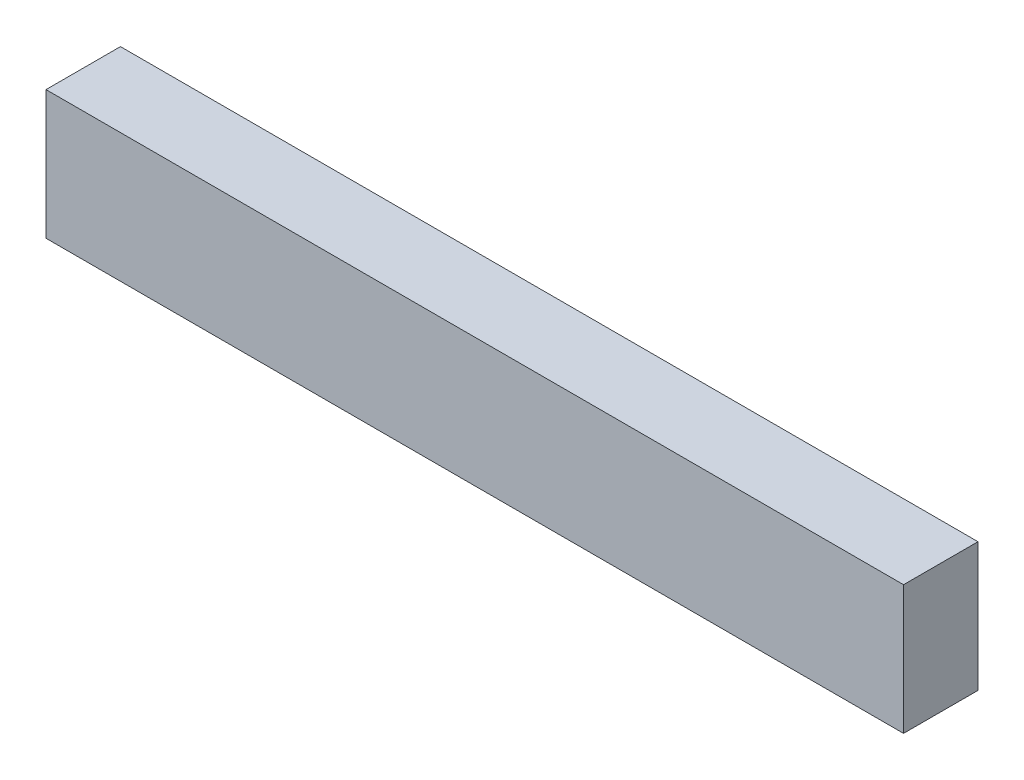
ISO-10303-21;
HEADER;
FILE_DESCRIPTION(('STEP AP214'),'2;1');
FILE_NAME('part.step','',(''),(''),'','','');
FILE_SCHEMA(('AUTOMOTIVE_DESIGN { 1 0 10303 214 1 1 1 1 }'));
ENDSEC;
DATA;
#1=APPLICATION_CONTEXT('core data for automotive mechanical design processes');
#2=APPLICATION_PROTOCOL_DEFINITION('international standard','automotive_design',2000,#1);
#3=PRODUCT_CONTEXT('',#1,'mechanical');
#4=PRODUCT('Part','Part','',(#3));
#5=PRODUCT_RELATED_PRODUCT_CATEGORY('part','',(#4));
#6=PRODUCT_DEFINITION_FORMATION('','',#4);
#7=PRODUCT_DEFINITION_CONTEXT('part definition',#1,'design');
#8=PRODUCT_DEFINITION('design','',#6,#7);
#9=PRODUCT_DEFINITION_SHAPE('','',#8);
#10=(LENGTH_UNIT() NAMED_UNIT(*) SI_UNIT(.MILLI.,.METRE.));
#11=(NAMED_UNIT(*) PLANE_ANGLE_UNIT() SI_UNIT($,.RADIAN.));
#12=(NAMED_UNIT(*) SI_UNIT($,.STERADIAN.) SOLID_ANGLE_UNIT());
#13=UNCERTAINTY_MEASURE_WITH_UNIT(LENGTH_MEASURE(1.E-05),#10,'distance_accuracy_value','');
#14=(GEOMETRIC_REPRESENTATION_CONTEXT(3) GLOBAL_UNCERTAINTY_ASSIGNED_CONTEXT((#13)) GLOBAL_UNIT_ASSIGNED_CONTEXT((#10,
#11,#12)) REPRESENTATION_CONTEXT('',''));
#15=CARTESIAN_POINT('',(0.,0.,0.));
#16=DIRECTION('',(0.,0.,1.));
#17=DIRECTION('',(1.,0.,0.));
#18=AXIS2_PLACEMENT_3D('',#15,#16,#17);
#19=CARTESIAN_POINT('',(-79.0368014902547,62.07,7.25));
#20=DIRECTION('',(1.,0.,0.));
#21=DIRECTION('',(0.,0.,-1.));
#22=AXIS2_PLACEMENT_3D('',#19,#20,#21);
#23=PLANE('',#22);
#24=DIRECTION('',(0.,-1.,0.));
#25=VECTOR('',#24,1.);
#26=CARTESIAN_POINT('',(-79.0368014902547,62.07,0.));
#27=LINE('',#26,#25);
#28=CARTESIAN_POINT('',(-79.0368014902547,62.07,0.));
#29=VERTEX_POINT('',#28);
#30=CARTESIAN_POINT('',(-79.0368014902547,49.53,0.));
#31=VERTEX_POINT('',#30);
#32=EDGE_CURVE('E128',#29,#31,#27,.T.);
#33=ORIENTED_EDGE('',*,*,#32,.T.);
#34=DIRECTION('',(0.,0.,-1.));
#35=VECTOR('',#34,1.);
#36=CARTESIAN_POINT('',(-79.0368014902547,49.53,7.25));
#37=LINE('',#36,#35);
#38=CARTESIAN_POINT('',(-79.0368014902547,49.53,7.25));
#39=VERTEX_POINT('',#38);
#40=EDGE_CURVE('E11',#39,#31,#37,.T.);
#41=ORIENTED_EDGE('',*,*,#40,.F.);
#42=DIRECTION('',(0.,-1.,0.));
#43=VECTOR('',#42,1.);
#44=CARTESIAN_POINT('',(-79.0368014902547,62.07,7.25));
#45=LINE('',#44,#43);
#46=CARTESIAN_POINT('',(-79.0368014902547,62.07,7.25));
#47=VERTEX_POINT('',#46);
#48=EDGE_CURVE('E148',#47,#39,#45,.T.);
#49=ORIENTED_EDGE('',*,*,#48,.F.);
#50=DIRECTION('',(0.,0.,-1.));
#51=VECTOR('',#50,1.);
#52=CARTESIAN_POINT('',(-79.0368014902547,62.07,7.25));
#53=LINE('',#52,#51);
#54=EDGE_CURVE('E153',#47,#29,#53,.T.);
#55=ORIENTED_EDGE('',*,*,#54,.T.);
#56=EDGE_LOOP('',(#33,#41,#49,#55));
#57=FACE_BOUND('',#56,.T.);
#58=ADVANCED_FACE('F32',(#57),#23,.F.);
#59=CARTESIAN_POINT('',(-79.0368014902547,49.53,7.25));
#60=DIRECTION('',(0.,1.,0.));
#61=DIRECTION('',(0.,0.,1.));
#62=AXIS2_PLACEMENT_3D('',#59,#60,#61);
#63=PLANE('',#62);
#64=DIRECTION('',(1.,0.,0.));
#65=VECTOR('',#64,1.);
#66=CARTESIAN_POINT('',(-79.0368014902547,49.53,0.));
#67=LINE('',#66,#65);
#68=CARTESIAN_POINT('',(4.46450000000037,49.53,0.));
#69=VERTEX_POINT('',#68);
#70=EDGE_CURVE('E132',#31,#69,#67,.T.);
#71=ORIENTED_EDGE('',*,*,#70,.T.);
#72=DIRECTION('',(0.,0.,-1.));
#73=VECTOR('',#72,1.);
#74=CARTESIAN_POINT('',(4.46450000000037,49.53,7.25));
#75=LINE('',#74,#73);
#76=CARTESIAN_POINT('',(4.46450000000037,49.53,7.25));
#77=VERTEX_POINT('',#76);
#78=EDGE_CURVE('E39',#77,#69,#75,.T.);
#79=ORIENTED_EDGE('',*,*,#78,.F.);
#80=DIRECTION('',(1.,0.,0.));
#81=VECTOR('',#80,1.);
#82=CARTESIAN_POINT('',(-79.0368014902547,49.53,7.25));
#83=LINE('',#82,#81);
#84=EDGE_CURVE('E83',#39,#77,#83,.T.);
#85=ORIENTED_EDGE('',*,*,#84,.F.);
#86=ORIENTED_EDGE('',*,*,#40,.T.);
#87=EDGE_LOOP('',(#71,#79,#85,#86));
#88=FACE_BOUND('',#87,.T.);
#89=ADVANCED_FACE('F182',(#88),#63,.F.);
#90=CARTESIAN_POINT('',(4.46450000000037,62.07,7.25));
#91=DIRECTION('',(-1.,0.,0.));
#92=DIRECTION('',(0.,0.,1.));
#93=AXIS2_PLACEMENT_3D('',#90,#91,#92);
#94=PLANE('',#93);
#95=DIRECTION('',(0.,1.,0.));
#96=VECTOR('',#95,1.);
#97=CARTESIAN_POINT('',(4.46450000000037,62.07,0.));
#98=LINE('',#97,#96);
#99=CARTESIAN_POINT('',(4.46450000000037,62.07,0.));
#100=VERTEX_POINT('',#99);
#101=EDGE_CURVE('E156',#69,#100,#98,.T.);
#102=ORIENTED_EDGE('',*,*,#101,.T.);
#103=DIRECTION('',(0.,0.,-1.));
#104=VECTOR('',#103,1.);
#105=CARTESIAN_POINT('',(4.46450000000037,62.07,7.25));
#106=LINE('',#105,#104);
#107=CARTESIAN_POINT('',(4.46450000000037,62.07,7.25));
#108=VERTEX_POINT('',#107);
#109=EDGE_CURVE('E160',#108,#100,#106,.T.);
#110=ORIENTED_EDGE('',*,*,#109,.F.);
#111=DIRECTION('',(0.,1.,0.));
#112=VECTOR('',#111,1.);
#113=CARTESIAN_POINT('',(4.46450000000037,62.07,7.25));
#114=LINE('',#113,#112);
#115=EDGE_CURVE('E151',#77,#108,#114,.T.);
#116=ORIENTED_EDGE('',*,*,#115,.F.);
#117=ORIENTED_EDGE('',*,*,#78,.T.);
#118=EDGE_LOOP('',(#102,#110,#116,#117));
#119=FACE_BOUND('',#118,.T.);
#120=ADVANCED_FACE('F165',(#119),#94,.F.);
#121=CARTESIAN_POINT('',(-79.0368014902547,62.07,7.25));
#122=DIRECTION('',(0.,-1.,0.));
#123=DIRECTION('',(0.,0.,-1.));
#124=AXIS2_PLACEMENT_3D('',#121,#122,#123);
#125=PLANE('',#124);
#126=DIRECTION('',(-1.,0.,0.));
#127=VECTOR('',#126,1.);
#128=CARTESIAN_POINT('',(-79.0368014902547,62.07,0.));
#129=LINE('',#128,#127);
#130=EDGE_CURVE('E76',#100,#29,#129,.T.);
#131=ORIENTED_EDGE('',*,*,#130,.T.);
#132=ORIENTED_EDGE('',*,*,#54,.F.);
#133=DIRECTION('',(-1.,0.,0.));
#134=VECTOR('',#133,1.);
#135=CARTESIAN_POINT('',(-79.0368014902547,62.07,7.25));
#136=LINE('',#135,#134);
#137=EDGE_CURVE('E55',#108,#47,#136,.T.);
#138=ORIENTED_EDGE('',*,*,#137,.F.);
#139=ORIENTED_EDGE('',*,*,#109,.T.);
#140=EDGE_LOOP('',(#131,#132,#138,#139));
#141=FACE_BOUND('',#140,.T.);
#142=ADVANCED_FACE('F173',(#141),#125,.F.);
#143=CARTESIAN_POINT('',(0.,0.,7.25));
#144=DIRECTION('',(0.,0.,1.));
#145=DIRECTION('',(1.,0.,0.));
#146=AXIS2_PLACEMENT_3D('',#143,#144,#145);
#147=PLANE('',#146);
#148=ORIENTED_EDGE('',*,*,#48,.T.);
#149=ORIENTED_EDGE('',*,*,#84,.T.);
#150=ORIENTED_EDGE('',*,*,#115,.T.);
#151=ORIENTED_EDGE('',*,*,#137,.T.);
#152=EDGE_LOOP('',(#148,#149,#150,#151));
#153=FACE_BOUND('',#152,.T.);
#154=ADVANCED_FACE('F175',(#153),#147,.T.);
#155=CARTESIAN_POINT('',(0.,0.,0.));
#156=DIRECTION('',(0.,0.,1.));
#157=DIRECTION('',(1.,0.,0.));
#158=AXIS2_PLACEMENT_3D('',#155,#156,#157);
#159=PLANE('',#158);
#160=DIRECTION('',(-1.,0.,0.));
#161=VECTOR('',#160,1.);
#162=CARTESIAN_POINT('',(-79.0368014902547,61.57,0.));
#163=LINE('',#162,#161);
#164=CARTESIAN_POINT('',(3.96450000000037,61.57,0.));
#165=VERTEX_POINT('',#164);
#166=CARTESIAN_POINT('',(-78.5368014902547,61.57,0.));
#167=VERTEX_POINT('',#166);
#168=EDGE_CURVE('E123',#165,#167,#163,.T.);
#169=ORIENTED_EDGE('',*,*,#168,.T.);
#170=DIRECTION('',(0.,-1.,0.));
#171=VECTOR('',#170,1.);
#172=CARTESIAN_POINT('',(-78.5368014902547,62.07,0.));
#173=LINE('',#172,#171);
#174=CARTESIAN_POINT('',(-78.5368014902547,50.03,0.));
#175=VERTEX_POINT('',#174);
#176=EDGE_CURVE('E142',#167,#175,#173,.T.);
#177=ORIENTED_EDGE('',*,*,#176,.T.);
#178=DIRECTION('',(1.,0.,0.));
#179=VECTOR('',#178,1.);
#180=CARTESIAN_POINT('',(-79.0368014902547,50.03,0.));
#181=LINE('',#180,#179);
#182=CARTESIAN_POINT('',(3.96450000000037,50.03,0.));
#183=VERTEX_POINT('',#182);
#184=EDGE_CURVE('E127',#175,#183,#181,.T.);
#185=ORIENTED_EDGE('',*,*,#184,.T.);
#186=DIRECTION('',(0.,1.,0.));
#187=VECTOR('',#186,1.);
#188=CARTESIAN_POINT('',(3.96450000000037,62.07,0.));
#189=LINE('',#188,#187);
#190=EDGE_CURVE('E46',#183,#165,#189,.T.);
#191=ORIENTED_EDGE('',*,*,#190,.T.);
#192=EDGE_LOOP('',(#169,#177,#185,#191));
#193=FACE_BOUND('',#192,.T.);
#194=ORIENTED_EDGE('',*,*,#32,.F.);
#195=ORIENTED_EDGE('',*,*,#130,.F.);
#196=ORIENTED_EDGE('',*,*,#101,.F.);
#197=ORIENTED_EDGE('',*,*,#70,.F.);
#198=EDGE_LOOP('',(#194,#195,#196,#197));
#199=FACE_BOUND('',#198,.T.);
#200=ADVANCED_FACE('F169',(#193,#199),#159,.F.);
#201=CARTESIAN_POINT('',(-78.5368014902547,62.07,7.25));
#202=DIRECTION('',(1.,0.,0.));
#203=DIRECTION('',(0.,0.,-1.));
#204=AXIS2_PLACEMENT_3D('',#201,#202,#203);
#205=PLANE('',#204);
#206=ORIENTED_EDGE('',*,*,#176,.F.);
#207=DIRECTION('',(0.,0.,-1.));
#208=VECTOR('',#207,1.);
#209=CARTESIAN_POINT('',(-78.5368014902547,61.57,7.25));
#210=LINE('',#209,#208);
#211=CARTESIAN_POINT('',(-78.5368014902547,61.57,7.05));
#212=VERTEX_POINT('',#211);
#213=EDGE_CURVE('E122',#212,#167,#210,.T.);
#214=ORIENTED_EDGE('',*,*,#213,.F.);
#215=DIRECTION('',(0.,-1.,0.));
#216=VECTOR('',#215,1.);
#217=CARTESIAN_POINT('',(-78.5368014902547,62.07,7.05));
#218=LINE('',#217,#216);
#219=CARTESIAN_POINT('',(-78.5368014902547,50.03,7.05));
#220=VERTEX_POINT('',#219);
#221=EDGE_CURVE('E110',#212,#220,#218,.T.);
#222=ORIENTED_EDGE('',*,*,#221,.T.);
#223=DIRECTION('',(0.,0.,-1.));
#224=VECTOR('',#223,1.);
#225=CARTESIAN_POINT('',(-78.5368014902547,50.03,7.25));
#226=LINE('',#225,#224);
#227=EDGE_CURVE('E120',#220,#175,#226,.T.);
#228=ORIENTED_EDGE('',*,*,#227,.T.);
#229=EDGE_LOOP('',(#206,#214,#222,#228));
#230=FACE_BOUND('',#229,.T.);
#231=ADVANCED_FACE('F119',(#230),#205,.T.);
#232=CARTESIAN_POINT('',(-79.0368014902547,50.03,7.25));
#233=DIRECTION('',(0.,1.,0.));
#234=DIRECTION('',(0.,0.,1.));
#235=AXIS2_PLACEMENT_3D('',#232,#233,#234);
#236=PLANE('',#235);
#237=ORIENTED_EDGE('',*,*,#184,.F.);
#238=ORIENTED_EDGE('',*,*,#227,.F.);
#239=DIRECTION('',(1.,0.,0.));
#240=VECTOR('',#239,1.);
#241=CARTESIAN_POINT('',(-79.0368014902547,50.03,7.05));
#242=LINE('',#241,#240);
#243=CARTESIAN_POINT('',(3.96450000000037,50.03,7.05));
#244=VERTEX_POINT('',#243);
#245=EDGE_CURVE('E106',#220,#244,#242,.T.);
#246=ORIENTED_EDGE('',*,*,#245,.T.);
#247=DIRECTION('',(0.,0.,-1.));
#248=VECTOR('',#247,1.);
#249=CARTESIAN_POINT('',(3.96450000000037,50.03,7.25));
#250=LINE('',#249,#248);
#251=EDGE_CURVE('E129',#244,#183,#250,.T.);
#252=ORIENTED_EDGE('',*,*,#251,.T.);
#253=EDGE_LOOP('',(#237,#238,#246,#252));
#254=FACE_BOUND('',#253,.T.);
#255=ADVANCED_FACE('F125',(#254),#236,.T.);
#256=CARTESIAN_POINT('',(3.96450000000037,62.07,7.25));
#257=DIRECTION('',(-1.,0.,0.));
#258=DIRECTION('',(0.,0.,1.));
#259=AXIS2_PLACEMENT_3D('',#256,#257,#258);
#260=PLANE('',#259);
#261=ORIENTED_EDGE('',*,*,#190,.F.);
#262=ORIENTED_EDGE('',*,*,#251,.F.);
#263=DIRECTION('',(0.,1.,0.));
#264=VECTOR('',#263,1.);
#265=CARTESIAN_POINT('',(3.96450000000037,62.07,7.05));
#266=LINE('',#265,#264);
#267=CARTESIAN_POINT('',(3.96450000000037,61.57,7.05));
#268=VERTEX_POINT('',#267);
#269=EDGE_CURVE('E111',#244,#268,#266,.T.);
#270=ORIENTED_EDGE('',*,*,#269,.T.);
#271=DIRECTION('',(0.,0.,-1.));
#272=VECTOR('',#271,1.);
#273=CARTESIAN_POINT('',(3.96450000000036,61.57,7.25));
#274=LINE('',#273,#272);
#275=EDGE_CURVE('E134',#268,#165,#274,.T.);
#276=ORIENTED_EDGE('',*,*,#275,.T.);
#277=EDGE_LOOP('',(#261,#262,#270,#276));
#278=FACE_BOUND('',#277,.T.);
#279=ADVANCED_FACE('F230',(#278),#260,.T.);
#280=CARTESIAN_POINT('',(-79.0368014902547,61.57,7.25));
#281=DIRECTION('',(0.,-1.,0.));
#282=DIRECTION('',(0.,0.,-1.));
#283=AXIS2_PLACEMENT_3D('',#280,#281,#282);
#284=PLANE('',#283);
#285=ORIENTED_EDGE('',*,*,#168,.F.);
#286=ORIENTED_EDGE('',*,*,#275,.F.);
#287=DIRECTION('',(-1.,0.,0.));
#288=VECTOR('',#287,1.);
#289=CARTESIAN_POINT('',(-79.0368014902547,61.57,7.05));
#290=LINE('',#289,#288);
#291=EDGE_CURVE('E137',#268,#212,#290,.T.);
#292=ORIENTED_EDGE('',*,*,#291,.T.);
#293=ORIENTED_EDGE('',*,*,#213,.T.);
#294=EDGE_LOOP('',(#285,#286,#292,#293));
#295=FACE_BOUND('',#294,.T.);
#296=ADVANCED_FACE('F239',(#295),#284,.T.);
#297=CARTESIAN_POINT('',(0.,0.,7.05));
#298=DIRECTION('',(0.,0.,1.));
#299=DIRECTION('',(1.,0.,0.));
#300=AXIS2_PLACEMENT_3D('',#297,#298,#299);
#301=PLANE('',#300);
#302=ORIENTED_EDGE('',*,*,#221,.F.);
#303=ORIENTED_EDGE('',*,*,#291,.F.);
#304=ORIENTED_EDGE('',*,*,#269,.F.);
#305=ORIENTED_EDGE('',*,*,#245,.F.);
#306=EDGE_LOOP('',(#302,#303,#304,#305));
#307=FACE_BOUND('',#306,.T.);
#308=ADVANCED_FACE('F108',(#307),#301,.F.);
#309=CLOSED_SHELL('',(#58,#89,#120,#142,#154,#200,#231,#255,#279,#296,#308));
#310=MANIFOLD_SOLID_BREP('B2',#309);
#311=ADVANCED_BREP_SHAPE_REPRESENTATION('',(#18,#310),#14);
#312=SHAPE_DEFINITION_REPRESENTATION(#9,#311);
ENDSEC;
END-ISO-10303-21;
